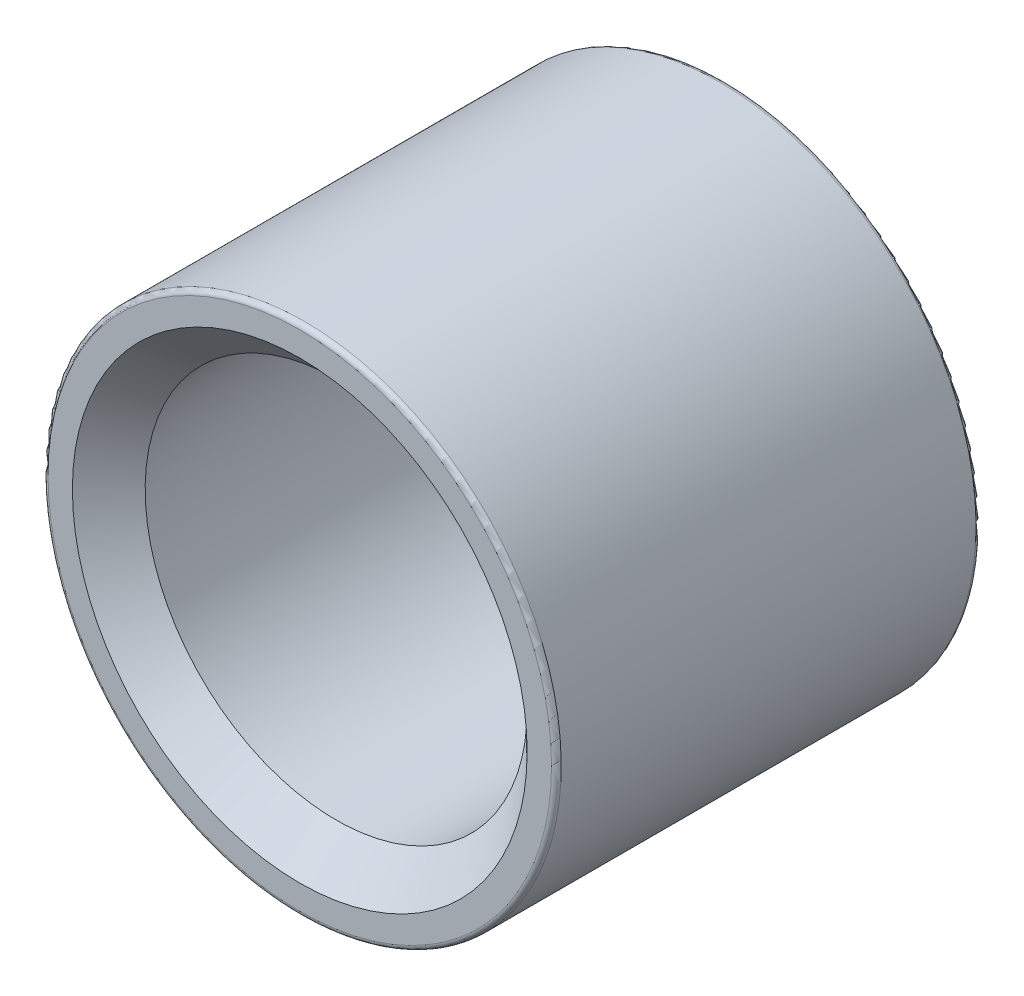
ISO-10303-21;
HEADER;
FILE_DESCRIPTION(('STEP AP214'),'2;1');
FILE_NAME('part.step','',(''),(''),'','','');
FILE_SCHEMA(('AUTOMOTIVE_DESIGN { 1 0 10303 214 1 1 1 1 }'));
ENDSEC;
DATA;
#1=APPLICATION_CONTEXT('core data for automotive mechanical design processes');
#2=APPLICATION_PROTOCOL_DEFINITION('international standard','automotive_design',2000,#1);
#3=PRODUCT_CONTEXT('',#1,'mechanical');
#4=PRODUCT('Part','Part','',(#3));
#5=PRODUCT_RELATED_PRODUCT_CATEGORY('part','',(#4));
#6=PRODUCT_DEFINITION_FORMATION('','',#4);
#7=PRODUCT_DEFINITION_CONTEXT('part definition',#1,'design');
#8=PRODUCT_DEFINITION('design','',#6,#7);
#9=PRODUCT_DEFINITION_SHAPE('','',#8);
#10=(LENGTH_UNIT() NAMED_UNIT(*) SI_UNIT(.MILLI.,.METRE.));
#11=(NAMED_UNIT(*) PLANE_ANGLE_UNIT() SI_UNIT($,.RADIAN.));
#12=(NAMED_UNIT(*) SI_UNIT($,.STERADIAN.) SOLID_ANGLE_UNIT());
#13=UNCERTAINTY_MEASURE_WITH_UNIT(LENGTH_MEASURE(1.E-05),#10,'distance_accuracy_value','');
#14=(GEOMETRIC_REPRESENTATION_CONTEXT(3) GLOBAL_UNCERTAINTY_ASSIGNED_CONTEXT((#13)) GLOBAL_UNIT_ASSIGNED_CONTEXT((#10,
#11,#12)) REPRESENTATION_CONTEXT('',''));
#15=CARTESIAN_POINT('',(0.,0.,0.));
#16=DIRECTION('',(0.,0.,1.));
#17=DIRECTION('',(1.,0.,0.));
#18=AXIS2_PLACEMENT_3D('',#15,#16,#17);
#19=CARTESIAN_POINT('',(0.,0.,-2.505));
#20=DIRECTION('',(0.,0.,-1.));
#21=DIRECTION('',(0.,1.,0.));
#22=AXIS2_PLACEMENT_3D('',#19,#20,#21);
#23=TOROIDAL_SURFACE('',#22,10.3791,0.2);
#24=CARTESIAN_POINT('',(0.,0.,-2.505));
#25=DIRECTION('',(0.,0.,-1.));
#26=DIRECTION('',(0.,1.,0.));
#27=AXIS2_PLACEMENT_3D('',#24,#25,#26);
#28=CIRCLE('',#27,10.5791);
#29=CARTESIAN_POINT('',(0.,10.5791,-2.505));
#30=VERTEX_POINT('',#29);
#31=EDGE_CURVE('E70',#30,#30,#28,.T.);
#32=ORIENTED_EDGE('',*,*,#31,.T.);
#33=EDGE_LOOP('',(#32));
#34=FACE_BOUND('',#33,.T.);
#35=CARTESIAN_POINT('',(0.,0.,-2.705));
#36=DIRECTION('',(0.,0.,-1.));
#37=DIRECTION('',(0.,1.,0.));
#38=AXIS2_PLACEMENT_3D('',#35,#36,#37);
#39=CIRCLE('',#38,10.3791);
#40=CARTESIAN_POINT('',(0.,10.3791,-2.705));
#41=VERTEX_POINT('',#40);
#42=EDGE_CURVE('E10',#41,#41,#39,.T.);
#43=ORIENTED_EDGE('',*,*,#42,.F.);
#44=EDGE_LOOP('',(#43));
#45=FACE_BOUND('',#44,.T.);
#46=ADVANCED_FACE('F39',(#34,#45),#23,.T.);
#47=CARTESIAN_POINT('',(0.,10.3791,-2.705));
#48=DIRECTION('',(0.,0.,-1.));
#49=DIRECTION('',(0.,1.,0.));
#50=AXIS2_PLACEMENT_3D('',#47,#48,#49);
#51=PLANE('',#50);
#52=ORIENTED_EDGE('',*,*,#42,.T.);
#53=EDGE_LOOP('',(#52));
#54=FACE_BOUND('',#53,.T.);
#55=ADVANCED_FACE('F89',(#54),#51,.T.);
#56=CARTESIAN_POINT('',(0.,0.,0.));
#57=DIRECTION('',(0.,0.,1.));
#58=DIRECTION('',(0.,-1.,0.));
#59=AXIS2_PLACEMENT_3D('',#56,#57,#58);
#60=PLANE('',#59);
#61=CARTESIAN_POINT('',(0.,0.,0.));
#62=DIRECTION('',(0.,0.,-1.));
#63=DIRECTION('',(0.,1.,0.));
#64=AXIS2_PLACEMENT_3D('',#61,#62,#63);
#65=CIRCLE('',#64,7.874);
#66=CARTESIAN_POINT('',(0.,7.874,0.));
#67=VERTEX_POINT('',#66);
#68=EDGE_CURVE('E46',#67,#67,#65,.T.);
#69=ORIENTED_EDGE('',*,*,#68,.F.);
#70=EDGE_LOOP('',(#69));
#71=FACE_BOUND('',#70,.T.);
#72=ADVANCED_FACE('F93',(#71),#60,.T.);
#73=CARTESIAN_POINT('',(0.,0.,-2.705));
#74=DIRECTION('',(0.,0.,-1.));
#75=DIRECTION('',(0.,1.,0.));
#76=AXIS2_PLACEMENT_3D('',#73,#74,#75);
#77=CYLINDRICAL_SURFACE('',#76,7.874);
#78=ORIENTED_EDGE('',*,*,#68,.T.);
#79=EDGE_LOOP('',(#78));
#80=FACE_BOUND('',#79,.T.);
#81=CARTESIAN_POINT('',(0.,0.,13.295));
#82=DIRECTION('',(0.,0.,-1.));
#83=DIRECTION('',(0.,1.,0.));
#84=AXIS2_PLACEMENT_3D('',#81,#82,#83);
#85=CIRCLE('',#84,7.874);
#86=CARTESIAN_POINT('',(0.,7.874,13.295));
#87=VERTEX_POINT('',#86);
#88=EDGE_CURVE('E51',#87,#87,#85,.T.);
#89=ORIENTED_EDGE('',*,*,#88,.F.);
#90=EDGE_LOOP('',(#89));
#91=FACE_BOUND('',#90,.T.);
#92=ADVANCED_FACE('F97',(#80,#91),#77,.F.);
#93=CARTESIAN_POINT('',(0.,0.,14.795));
#94=DIRECTION('',(0.,0.,1.));
#95=DIRECTION('',(0.,-1.,0.));
#96=AXIS2_PLACEMENT_3D('',#93,#94,#95);
#97=CONICAL_SURFACE('',#96,9.374,0.785398163397446);
#98=ORIENTED_EDGE('',*,*,#88,.T.);
#99=EDGE_LOOP('',(#98));
#100=FACE_BOUND('',#99,.T.);
#101=CARTESIAN_POINT('',(0.,0.,14.795));
#102=DIRECTION('',(0.,0.,-1.));
#103=DIRECTION('',(0.,1.,0.));
#104=AXIS2_PLACEMENT_3D('',#101,#102,#103);
#105=CIRCLE('',#104,9.374);
#106=CARTESIAN_POINT('',(0.,9.374,14.795));
#107=VERTEX_POINT('',#106);
#108=EDGE_CURVE('E56',#107,#107,#105,.T.);
#109=ORIENTED_EDGE('',*,*,#108,.F.);
#110=EDGE_LOOP('',(#109));
#111=FACE_BOUND('',#110,.T.);
#112=ADVANCED_FACE('F103',(#100,#111),#97,.F.);
#113=CARTESIAN_POINT('',(0.,9.374,14.795));
#114=DIRECTION('',(0.,0.,1.));
#115=DIRECTION('',(0.,-1.,0.));
#116=AXIS2_PLACEMENT_3D('',#113,#114,#115);
#117=PLANE('',#116);
#118=ORIENTED_EDGE('',*,*,#108,.T.);
#119=EDGE_LOOP('',(#118));
#120=FACE_BOUND('',#119,.T.);
#121=CARTESIAN_POINT('',(0.,0.,14.795));
#122=DIRECTION('',(0.,0.,-1.));
#123=DIRECTION('',(0.,1.,0.));
#124=AXIS2_PLACEMENT_3D('',#121,#122,#123);
#125=CIRCLE('',#124,10.3791);
#126=CARTESIAN_POINT('',(0.,10.3791,14.795));
#127=VERTEX_POINT('',#126);
#128=EDGE_CURVE('E62',#127,#127,#125,.T.);
#129=ORIENTED_EDGE('',*,*,#128,.F.);
#130=EDGE_LOOP('',(#129));
#131=FACE_BOUND('',#130,.T.);
#132=ADVANCED_FACE('F85',(#120,#131),#117,.T.);
#133=CARTESIAN_POINT('',(0.,0.,14.595));
#134=DIRECTION('',(0.,0.,-1.));
#135=DIRECTION('',(0.,1.,0.));
#136=AXIS2_PLACEMENT_3D('',#133,#134,#135);
#137=TOROIDAL_SURFACE('',#136,10.3791,0.2);
#138=ORIENTED_EDGE('',*,*,#128,.T.);
#139=EDGE_LOOP('',(#138));
#140=FACE_BOUND('',#139,.T.);
#141=CARTESIAN_POINT('',(0.,0.,14.595));
#142=DIRECTION('',(0.,0.,-1.));
#143=DIRECTION('',(0.,1.,0.));
#144=AXIS2_PLACEMENT_3D('',#141,#142,#143);
#145=CIRCLE('',#144,10.5791);
#146=CARTESIAN_POINT('',(0.,10.5791,14.595));
#147=VERTEX_POINT('',#146);
#148=EDGE_CURVE('E66',#147,#147,#145,.T.);
#149=ORIENTED_EDGE('',*,*,#148,.F.);
#150=EDGE_LOOP('',(#149));
#151=FACE_BOUND('',#150,.T.);
#152=ADVANCED_FACE('F79',(#140,#151),#137,.T.);
#153=CARTESIAN_POINT('',(0.,0.,-2.705));
#154=DIRECTION('',(0.,0.,-1.));
#155=DIRECTION('',(0.,1.,0.));
#156=AXIS2_PLACEMENT_3D('',#153,#154,#155);
#157=CYLINDRICAL_SURFACE('',#156,10.5791);
#158=ORIENTED_EDGE('',*,*,#148,.T.);
#159=EDGE_LOOP('',(#158));
#160=FACE_BOUND('',#159,.T.);
#161=ORIENTED_EDGE('',*,*,#31,.F.);
#162=EDGE_LOOP('',(#161));
#163=FACE_BOUND('',#162,.T.);
#164=ADVANCED_FACE('F77',(#160,#163),#157,.T.);
#165=CLOSED_SHELL('',(#46,#55,#72,#92,#112,#132,#152,#164));
#166=MANIFOLD_SOLID_BREP('B2',#165);
#167=ADVANCED_BREP_SHAPE_REPRESENTATION('',(#18,#166),#14);
#168=SHAPE_DEFINITION_REPRESENTATION(#9,#167);
ENDSEC;
END-ISO-10303-21;
